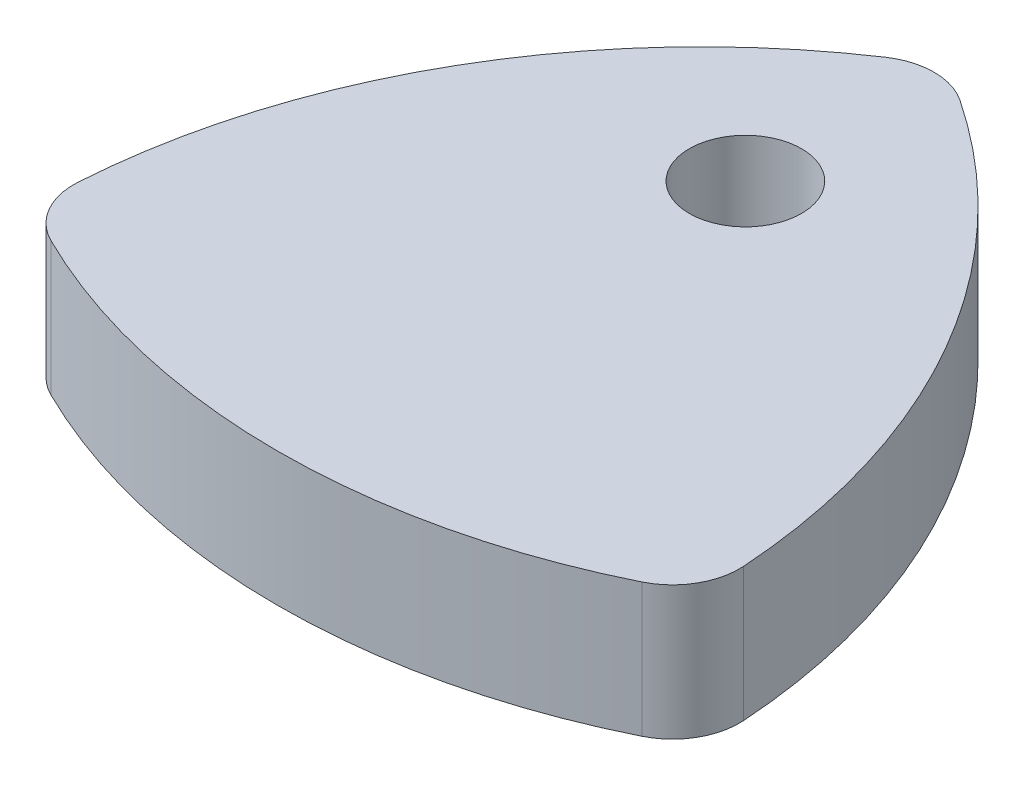
ISO-10303-21;
HEADER;
FILE_DESCRIPTION(('STEP AP214'),'2;1');
FILE_NAME('part.step','',(''),(''),'','','');
FILE_SCHEMA(('AUTOMOTIVE_DESIGN { 1 0 10303 214 1 1 1 1 }'));
ENDSEC;
DATA;
#1=APPLICATION_CONTEXT('core data for automotive mechanical design processes');
#2=APPLICATION_PROTOCOL_DEFINITION('international standard','automotive_design',2000,#1);
#3=PRODUCT_CONTEXT('',#1,'mechanical');
#4=PRODUCT('Part','Part','',(#3));
#5=PRODUCT_RELATED_PRODUCT_CATEGORY('part','',(#4));
#6=PRODUCT_DEFINITION_FORMATION('','',#4);
#7=PRODUCT_DEFINITION_CONTEXT('part definition',#1,'design');
#8=PRODUCT_DEFINITION('design','',#6,#7);
#9=PRODUCT_DEFINITION_SHAPE('','',#8);
#10=(LENGTH_UNIT() NAMED_UNIT(*) SI_UNIT(.MILLI.,.METRE.));
#11=(NAMED_UNIT(*) PLANE_ANGLE_UNIT() SI_UNIT($,.RADIAN.));
#12=(NAMED_UNIT(*) SI_UNIT($,.STERADIAN.) SOLID_ANGLE_UNIT());
#13=UNCERTAINTY_MEASURE_WITH_UNIT(LENGTH_MEASURE(1.E-05),#10,'distance_accuracy_value','');
#14=(GEOMETRIC_REPRESENTATION_CONTEXT(3) GLOBAL_UNCERTAINTY_ASSIGNED_CONTEXT((#13)) GLOBAL_UNIT_ASSIGNED_CONTEXT((#10,
#11,#12)) REPRESENTATION_CONTEXT('',''));
#15=CARTESIAN_POINT('',(0.,0.,0.));
#16=DIRECTION('',(0.,0.,1.));
#17=DIRECTION('',(1.,0.,0.));
#18=AXIS2_PLACEMENT_3D('',#15,#16,#17);
#19=CARTESIAN_POINT('',(23.2026080030085,10.,16.2440003540997));
#20=DIRECTION('',(0.,1.,0.));
#21=DIRECTION('',(0.,0.,1.));
#22=AXIS2_PLACEMENT_3D('',#19,#20,#21);
#23=CYLINDRICAL_SURFACE('',#22,5.);
#24=DIRECTION('',(0.,-1.,0.));
#25=VECTOR('',#24,1.);
#26=CARTESIAN_POINT('',(25.4141306132352,10.,20.7283250239309));
#27=LINE('',#26,#25);
#28=CARTESIAN_POINT('',(25.4141306132351,0.,20.7283250239309));
#29=VERTEX_POINT('',#28);
#30=CARTESIAN_POINT('',(25.4141306132351,10.,20.7283250239309));
#31=VERTEX_POINT('',#30);
#32=EDGE_CURVE('E131',#29,#31,#27,.F.);
#33=ORIENTED_EDGE('',*,*,#32,.F.);
#34=CARTESIAN_POINT('',(23.2026080030085,0.,16.2440003540997));
#35=DIRECTION('',(0.,1.,0.));
#36=DIRECTION('',(0.,0.,1.));
#37=AXIS2_PLACEMENT_3D('',#34,#35,#36);
#38=CIRCLE('',#37,5.);
#39=CARTESIAN_POINT('',(28.1919083910129,0.,15.917072780684));
#40=VERTEX_POINT('',#39);
#41=EDGE_CURVE('E42',#40,#29,#38,.F.);
#42=ORIENTED_EDGE('',*,*,#41,.F.);
#43=DIRECTION('',(0.,-1.,0.));
#44=VECTOR('',#43,1.);
#45=CARTESIAN_POINT('',(28.1919083910129,10.,15.917072780684));
#46=LINE('',#45,#44);
#47=CARTESIAN_POINT('',(28.1919083910129,10.,15.917072780684));
#48=VERTEX_POINT('',#47);
#49=EDGE_CURVE('E134',#48,#40,#46,.T.);
#50=ORIENTED_EDGE('',*,*,#49,.F.);
#51=CARTESIAN_POINT('',(23.2026080030085,10.,16.2440003540997));
#52=DIRECTION('',(0.,1.,0.));
#53=DIRECTION('',(0.,0.,1.));
#54=AXIS2_PLACEMENT_3D('',#51,#52,#53);
#55=CIRCLE('',#54,5.);
#56=EDGE_CURVE('E11',#31,#48,#55,.T.);
#57=ORIENTED_EDGE('',*,*,#56,.F.);
#58=EDGE_LOOP('',(#33,#42,#50,#57));
#59=FACE_BOUND('',#58,.T.);
#60=ADVANCED_FACE('F35',(#59),#23,.T.);
#61=CARTESIAN_POINT('',(-16.6047989810702,10.,16.2440003540999));
#62=DIRECTION('',(0.,1.,0.));
#63=DIRECTION('',(0.,0.,1.));
#64=AXIS2_PLACEMENT_3D('',#61,#62,#63);
#65=CYLINDRICAL_SURFACE('',#64,5.);
#66=DIRECTION('',(0.,-1.,0.));
#67=VECTOR('',#66,1.);
#68=CARTESIAN_POINT('',(-21.5940993690746,10.,15.9170727806842));
#69=LINE('',#68,#67);
#70=CARTESIAN_POINT('',(-21.5940993690745,0.,15.9170727806842));
#71=VERTEX_POINT('',#70);
#72=CARTESIAN_POINT('',(-21.5940993690745,10.,15.9170727806842));
#73=VERTEX_POINT('',#72);
#74=EDGE_CURVE('E96',#71,#73,#69,.F.);
#75=ORIENTED_EDGE('',*,*,#74,.F.);
#76=CARTESIAN_POINT('',(-16.6047989810702,0.,16.2440003540999));
#77=DIRECTION('',(0.,1.,0.));
#78=DIRECTION('',(0.,0.,1.));
#79=AXIS2_PLACEMENT_3D('',#76,#77,#78);
#80=CIRCLE('',#79,5.);
#81=CARTESIAN_POINT('',(-18.8163215912968,0.,20.728325023931));
#82=VERTEX_POINT('',#81);
#83=EDGE_CURVE('E110',#82,#71,#80,.F.);
#84=ORIENTED_EDGE('',*,*,#83,.F.);
#85=DIRECTION('',(0.,-1.,0.));
#86=VECTOR('',#85,1.);
#87=CARTESIAN_POINT('',(-18.8163215912968,10.,20.7283250239311));
#88=LINE('',#87,#86);
#89=CARTESIAN_POINT('',(-18.8163215912968,10.,20.728325023931));
#90=VERTEX_POINT('',#89);
#91=EDGE_CURVE('E125',#90,#82,#88,.T.);
#92=ORIENTED_EDGE('',*,*,#91,.F.);
#93=CARTESIAN_POINT('',(-16.6047989810702,10.,16.2440003540999));
#94=DIRECTION('',(0.,1.,0.));
#95=DIRECTION('',(0.,0.,1.));
#96=AXIS2_PLACEMENT_3D('',#93,#94,#95);
#97=CIRCLE('',#96,5.);
#98=EDGE_CURVE('E129',#73,#90,#97,.T.);
#99=ORIENTED_EDGE('',*,*,#98,.F.);
#100=EDGE_LOOP('',(#75,#84,#92,#99));
#101=FACE_BOUND('',#100,.T.);
#102=ADVANCED_FACE('F140',(#101),#65,.T.);
#103=CARTESIAN_POINT('',(3.29890451096914,10.,-18.2302253528986));
#104=DIRECTION('',(0.,-1.,0.));
#105=DIRECTION('',(0.,0.,-1.));
#106=AXIS2_PLACEMENT_3D('',#103,#104,#105);
#107=CYLINDRICAL_SURFACE('',#106,5.);
#108=DIRECTION('',(0.,-1.,0.));
#109=VECTOR('',#108,1.);
#110=CARTESIAN_POINT('',(0.521126733191355,10.,-22.387622449314));
#111=LINE('',#110,#109);
#112=CARTESIAN_POINT('',(0.521126733191362,10.,-22.387622449314));
#113=VERTEX_POINT('',#112);
#114=CARTESIAN_POINT('',(0.521126733191362,0.,-22.387622449314));
#115=VERTEX_POINT('',#114);
#116=EDGE_CURVE('E89',#113,#115,#111,.T.);
#117=ORIENTED_EDGE('',*,*,#116,.F.);
#118=CARTESIAN_POINT('',(3.29890451096914,10.,-18.2302253528986));
#119=DIRECTION('',(0.,1.,0.));
#120=DIRECTION('',(0.,0.,1.));
#121=AXIS2_PLACEMENT_3D('',#118,#119,#120);
#122=CIRCLE('',#121,5.);
#123=CARTESIAN_POINT('',(6.07668228874693,10.,-22.387622449314));
#124=VERTEX_POINT('',#123);
#125=EDGE_CURVE('E97',#124,#113,#122,.T.);
#126=ORIENTED_EDGE('',*,*,#125,.F.);
#127=DIRECTION('',(0.,-1.,0.));
#128=VECTOR('',#127,1.);
#129=CARTESIAN_POINT('',(6.07668228874691,10.,-22.3876224493141));
#130=LINE('',#129,#128);
#131=CARTESIAN_POINT('',(6.07668228874693,0.,-22.387622449314));
#132=VERTEX_POINT('',#131);
#133=EDGE_CURVE('E92',#132,#124,#130,.F.);
#134=ORIENTED_EDGE('',*,*,#133,.F.);
#135=CARTESIAN_POINT('',(3.29890451096914,0.,-18.2302253528986));
#136=DIRECTION('',(0.,1.,0.));
#137=DIRECTION('',(0.,0.,1.));
#138=AXIS2_PLACEMENT_3D('',#135,#136,#137);
#139=CIRCLE('',#138,5.);
#140=EDGE_CURVE('E85',#115,#132,#139,.F.);
#141=ORIENTED_EDGE('',*,*,#140,.F.);
#142=EDGE_LOOP('',(#117,#126,#134,#141));
#143=FACE_BOUND('',#142,.T.);
#144=ADVANCED_FACE('F87',(#143),#107,.T.);
#145=CARTESIAN_POINT('',(-21.7010954890309,10.,19.186348514841));
#146=DIRECTION('',(0.,-1.,0.));
#147=DIRECTION('',(0.,0.,-1.));
#148=AXIS2_PLACEMENT_3D('',#145,#146,#147);
#149=CYLINDRICAL_SURFACE('',#148,50.0000000000001);
#150=CARTESIAN_POINT('',(-21.7010954890309,10.,19.186348514841));
#151=DIRECTION('',(0.,1.,0.));
#152=DIRECTION('',(0.,0.,1.));
#153=AXIS2_PLACEMENT_3D('',#150,#151,#152);
#154=CIRCLE('',#153,50.0000000000001);
#155=EDGE_CURVE('E116',#48,#124,#154,.T.);
#156=ORIENTED_EDGE('',*,*,#155,.F.);
#157=ORIENTED_EDGE('',*,*,#49,.T.);
#158=CARTESIAN_POINT('',(-21.7010954890309,0.,19.186348514841));
#159=DIRECTION('',(0.,1.,0.));
#160=DIRECTION('',(0.,0.,1.));
#161=AXIS2_PLACEMENT_3D('',#158,#159,#160);
#162=CIRCLE('',#161,50.0000000000001);
#163=EDGE_CURVE('E113',#40,#132,#162,.T.);
#164=ORIENTED_EDGE('',*,*,#163,.T.);
#165=ORIENTED_EDGE('',*,*,#133,.T.);
#166=EDGE_LOOP('',(#156,#157,#164,#165));
#167=FACE_BOUND('',#166,.T.);
#168=ADVANCED_FACE('F173',(#167),#149,.T.);
#169=CARTESIAN_POINT('',(28.2989045109694,10.,19.186348514841));
#170=DIRECTION('',(0.,-1.,0.));
#171=DIRECTION('',(0.,0.,-1.));
#172=AXIS2_PLACEMENT_3D('',#169,#170,#171);
#173=CYLINDRICAL_SURFACE('',#172,50.0000000000003);
#174=CARTESIAN_POINT('',(28.2989045109694,0.,19.186348514841));
#175=DIRECTION('',(0.,1.,0.));
#176=DIRECTION('',(0.,0.,1.));
#177=AXIS2_PLACEMENT_3D('',#174,#175,#176);
#178=CIRCLE('',#177,50.0000000000003);
#179=EDGE_CURVE('E103',#115,#71,#178,.T.);
#180=ORIENTED_EDGE('',*,*,#179,.T.);
#181=ORIENTED_EDGE('',*,*,#74,.T.);
#182=CARTESIAN_POINT('',(28.2989045109694,10.,19.186348514841));
#183=DIRECTION('',(0.,1.,0.));
#184=DIRECTION('',(0.,0.,1.));
#185=AXIS2_PLACEMENT_3D('',#182,#183,#184);
#186=CIRCLE('',#185,50.0000000000003);
#187=EDGE_CURVE('E105',#113,#73,#186,.T.);
#188=ORIENTED_EDGE('',*,*,#187,.F.);
#189=ORIENTED_EDGE('',*,*,#116,.T.);
#190=EDGE_LOOP('',(#180,#181,#188,#189));
#191=FACE_BOUND('',#190,.T.);
#192=ADVANCED_FACE('F101',(#191),#173,.T.);
#193=CARTESIAN_POINT('',(3.29890451096901,10.,-24.114921674381));
#194=DIRECTION('',(0.,-1.,0.));
#195=DIRECTION('',(0.,0.,-1.));
#196=AXIS2_PLACEMENT_3D('',#193,#194,#195);
#197=CYLINDRICAL_SURFACE('',#196,50.0000000000001);
#198=CARTESIAN_POINT('',(3.29890451096901,0.,-24.114921674381));
#199=DIRECTION('',(0.,1.,0.));
#200=DIRECTION('',(0.,0.,1.));
#201=AXIS2_PLACEMENT_3D('',#198,#199,#200);
#202=CIRCLE('',#201,50.0000000000001);
#203=EDGE_CURVE('E112',#82,#29,#202,.T.);
#204=ORIENTED_EDGE('',*,*,#203,.T.);
#205=ORIENTED_EDGE('',*,*,#32,.T.);
#206=CARTESIAN_POINT('',(3.29890451096901,10.,-24.114921674381));
#207=DIRECTION('',(0.,1.,0.));
#208=DIRECTION('',(0.,0.,1.));
#209=AXIS2_PLACEMENT_3D('',#206,#207,#208);
#210=CIRCLE('',#209,50.0000000000001);
#211=EDGE_CURVE('E106',#90,#31,#210,.T.);
#212=ORIENTED_EDGE('',*,*,#211,.F.);
#213=ORIENTED_EDGE('',*,*,#91,.T.);
#214=EDGE_LOOP('',(#204,#205,#212,#213));
#215=FACE_BOUND('',#214,.T.);
#216=ADVANCED_FACE('F137',(#215),#197,.T.);
#217=CARTESIAN_POINT('',(3.29890451096924,10.,19.186348514841));
#218=DIRECTION('',(0.,1.,0.));
#219=DIRECTION('',(0.,0.,1.));
#220=AXIS2_PLACEMENT_3D('',#217,#218,#219);
#221=PLANE('',#220);
#222=CARTESIAN_POINT('',(3.29890451096901,10.,-9.11492167438101));
#223=DIRECTION('',(0.,1.,0.));
#224=DIRECTION('',(0.,0.,1.));
#225=AXIS2_PLACEMENT_3D('',#222,#223,#224);
#226=CIRCLE('',#225,4.2);
#227=CARTESIAN_POINT('',(3.29890451096901,10.,-4.91492167438102));
#228=VERTEX_POINT('',#227);
#229=EDGE_CURVE('E145',#228,#228,#226,.T.);
#230=ORIENTED_EDGE('',*,*,#229,.F.);
#231=EDGE_LOOP('',(#230));
#232=FACE_BOUND('',#231,.T.);
#233=ORIENTED_EDGE('',*,*,#211,.T.);
#234=ORIENTED_EDGE('',*,*,#56,.T.);
#235=ORIENTED_EDGE('',*,*,#155,.T.);
#236=ORIENTED_EDGE('',*,*,#125,.T.);
#237=ORIENTED_EDGE('',*,*,#187,.T.);
#238=ORIENTED_EDGE('',*,*,#98,.T.);
#239=EDGE_LOOP('',(#233,#234,#235,#236,#237,#238));
#240=FACE_BOUND('',#239,.T.);
#241=ADVANCED_FACE('F141',(#232,#240),#221,.T.);
#242=CARTESIAN_POINT('',(3.29890451096924,0.,19.186348514841));
#243=DIRECTION('',(0.,1.,0.));
#244=DIRECTION('',(0.,0.,1.));
#245=AXIS2_PLACEMENT_3D('',#242,#243,#244);
#246=PLANE('',#245);
#247=CARTESIAN_POINT('',(3.29890451096901,0.,-9.11492167438101));
#248=DIRECTION('',(0.,1.,0.));
#249=DIRECTION('',(0.,0.,1.));
#250=AXIS2_PLACEMENT_3D('',#247,#248,#249);
#251=CIRCLE('',#250,4.2);
#252=CARTESIAN_POINT('',(3.29890451096901,0.,-4.91492167438102));
#253=VERTEX_POINT('',#252);
#254=EDGE_CURVE('E118',#253,#253,#251,.T.);
#255=ORIENTED_EDGE('',*,*,#254,.T.);
#256=EDGE_LOOP('',(#255));
#257=FACE_BOUND('',#256,.T.);
#258=ORIENTED_EDGE('',*,*,#163,.F.);
#259=ORIENTED_EDGE('',*,*,#41,.T.);
#260=ORIENTED_EDGE('',*,*,#203,.F.);
#261=ORIENTED_EDGE('',*,*,#83,.T.);
#262=ORIENTED_EDGE('',*,*,#179,.F.);
#263=ORIENTED_EDGE('',*,*,#140,.T.);
#264=EDGE_LOOP('',(#258,#259,#260,#261,#262,#263));
#265=FACE_BOUND('',#264,.T.);
#266=ADVANCED_FACE('F108',(#257,#265),#246,.F.);
#267=CARTESIAN_POINT('',(3.29890451096901,0.,-9.11492167438101));
#268=DIRECTION('',(0.,1.,0.));
#269=DIRECTION('',(0.,0.,1.));
#270=AXIS2_PLACEMENT_3D('',#267,#268,#269);
#271=CYLINDRICAL_SURFACE('',#270,4.2);
#272=ORIENTED_EDGE('',*,*,#254,.F.);
#273=EDGE_LOOP('',(#272));
#274=FACE_BOUND('',#273,.T.);
#275=ORIENTED_EDGE('',*,*,#229,.T.);
#276=EDGE_LOOP('',(#275));
#277=FACE_BOUND('',#276,.T.);
#278=ADVANCED_FACE('F152',(#274,#277),#271,.F.);
#279=CLOSED_SHELL('',(#60,#102,#144,#168,#192,#216,#241,#266,#278));
#280=MANIFOLD_SOLID_BREP('B2',#279);
#281=ADVANCED_BREP_SHAPE_REPRESENTATION('',(#18,#280),#14);
#282=SHAPE_DEFINITION_REPRESENTATION(#9,#281);
ENDSEC;
END-ISO-10303-21;
